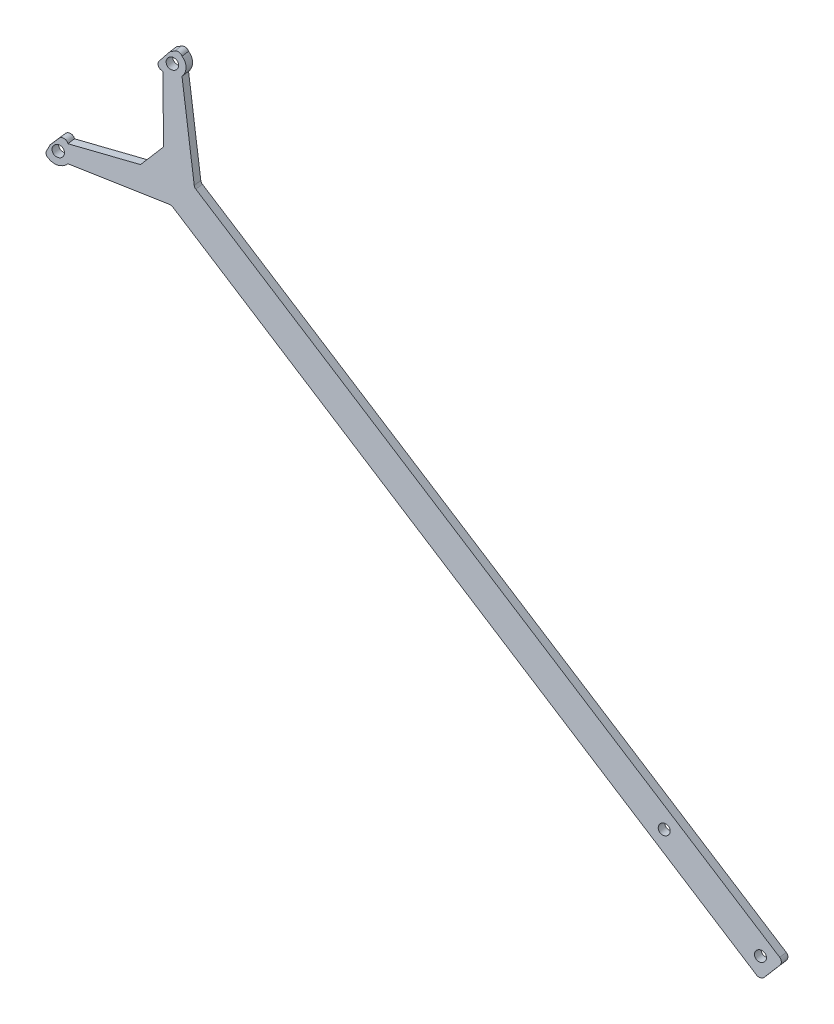
ISO-10303-21;
HEADER;
FILE_DESCRIPTION(('STEP AP214'),'2;1');
FILE_NAME('part.step','',(''),(''),'','','');
FILE_SCHEMA(('AUTOMOTIVE_DESIGN { 1 0 10303 214 1 1 1 1 }'));
ENDSEC;
DATA;
#1=APPLICATION_CONTEXT('core data for automotive mechanical design processes');
#2=APPLICATION_PROTOCOL_DEFINITION('international standard','automotive_design',2000,#1);
#3=PRODUCT_CONTEXT('',#1,'mechanical');
#4=PRODUCT('Part','Part','',(#3));
#5=PRODUCT_RELATED_PRODUCT_CATEGORY('part','',(#4));
#6=PRODUCT_DEFINITION_FORMATION('','',#4);
#7=PRODUCT_DEFINITION_CONTEXT('part definition',#1,'design');
#8=PRODUCT_DEFINITION('design','',#6,#7);
#9=PRODUCT_DEFINITION_SHAPE('','',#8);
#10=(LENGTH_UNIT() NAMED_UNIT(*) SI_UNIT(.MILLI.,.METRE.));
#11=(NAMED_UNIT(*) PLANE_ANGLE_UNIT() SI_UNIT($,.RADIAN.));
#12=(NAMED_UNIT(*) SI_UNIT($,.STERADIAN.) SOLID_ANGLE_UNIT());
#13=UNCERTAINTY_MEASURE_WITH_UNIT(LENGTH_MEASURE(1.E-05),#10,'distance_accuracy_value','');
#14=(GEOMETRIC_REPRESENTATION_CONTEXT(3) GLOBAL_UNCERTAINTY_ASSIGNED_CONTEXT((#13)) GLOBAL_UNIT_ASSIGNED_CONTEXT((#10,
#11,#12)) REPRESENTATION_CONTEXT('',''));
#15=CARTESIAN_POINT('',(0.,0.,0.));
#16=DIRECTION('',(0.,0.,1.));
#17=DIRECTION('',(1.,0.,0.));
#18=AXIS2_PLACEMENT_3D('',#15,#16,#17);
#19=CARTESIAN_POINT('',(38.6285026922329,20.4555824476356,159.237957676174));
#20=DIRECTION('',(-0.233930394424774,-0.123876985558802,-0.964329333274237));
#21=DIRECTION('',(-0.97181465537802,0.,0.235746210133905));
#22=AXIS2_PLACEMENT_3D('',#19,#20,#21);
#23=PLANE('',#22);
#24=DIRECTION('',(-0.96816081267746,-0.0612294878605861,0.242725339863909));
#25=VECTOR('',#24,1.);
#26=CARTESIAN_POINT('',(-151.084886063584,13.4326785363502,206.161454104588));
#27=LINE('',#26,#25);
#28=CARTESIAN_POINT('',(-138.182149915556,14.2486875257651,202.926639210517));
#29=VERTEX_POINT('',#28);
#30=CARTESIAN_POINT('',(-151.084886063584,13.4326785363502,206.161454104588));
#31=VERTEX_POINT('',#30);
#32=EDGE_CURVE('E263',#29,#31,#27,.T.);
#33=ORIENTED_EDGE('',*,*,#32,.T.);
#34=CARTESIAN_POINT('',(-152.007478281162,13.1480212719928,206.421826610653));
#35=DIRECTION('',(-0.233930394424774,-0.123876985558802,-0.964329333274237));
#36=DIRECTION('',(-0.97181465537802,0.,0.235746210133905));
#37=AXIS2_PLACEMENT_3D('',#34,#35,#36);
#38=CIRCLE('',#37,1.);
#39=CARTESIAN_POINT('',(-152.757094919694,13.8026350163769,206.519580080663));
#40=VERTEX_POINT('',#39);
#41=EDGE_CURVE('E337',#31,#40,#38,.F.);
#42=ORIENTED_EDGE('',*,*,#41,.T.);
#43=DIRECTION('',(-0.619153830481359,-0.745744821042901,0.245994300925757));
#44=VECTOR('',#43,1.);
#45=CARTESIAN_POINT('',(-154.143791942463,12.132416611556,207.070524850635));
#46=LINE('',#45,#44);
#47=CARTESIAN_POINT('',(-154.143791942463,12.132416611556,207.070524850635));
#48=VERTEX_POINT('',#47);
#49=EDGE_CURVE('E266',#40,#48,#46,.T.);
#50=ORIENTED_EDGE('',*,*,#49,.T.);
#51=DIRECTION('',(-0.361598481731838,-0.909614859686358,0.204566236331896));
#52=VECTOR('',#51,1.);
#53=CARTESIAN_POINT('',(-155.327539009485,9.1546554298249,207.740203221822));
#54=LINE('',#53,#52);
#55=CARTESIAN_POINT('',(-154.615897337573,10.9448173697854,207.337607896358));
#56=VERTEX_POINT('',#55);
#57=EDGE_CURVE('E268',#48,#56,#54,.T.);
#58=ORIENTED_EDGE('',*,*,#57,.T.);
#59=CARTESIAN_POINT('',(-153.713387997691,10.5482630866328,207.169615063356));
#60=DIRECTION('',(-0.233930394424774,-0.123876985558802,-0.964329333274237));
#61=DIRECTION('',(-0.97181465537802,0.,0.235746210133905));
#62=AXIS2_PLACEMENT_3D('',#59,#60,#61);
#63=CIRCLE('',#62,1.);
#64=CARTESIAN_POINT('',(-154.143773561432,9.67207967251809,207.386573334352));
#65=VERTEX_POINT('',#64);
#66=EDGE_CURVE('E335',#56,#65,#63,.F.);
#67=ORIENTED_EDGE('',*,*,#66,.T.);
#68=CARTESIAN_POINT('',(-152.614185290752,11.5522553092236,206.77399456351));
#69=DIRECTION('',(0.233930394424774,0.123876985558802,0.964329333274237));
#70=DIRECTION('',(0.97181465537802,0.,-0.235746210133905));
#71=AXIS2_PLACEMENT_3D('',#68,#69,#70);
#72=CIRCLE('',#71,2.49999069061246);
#73=CARTESIAN_POINT('',(-150.725075349122,9.93407152149013,206.523598256231));
#74=VERTEX_POINT('',#73);
#75=EDGE_CURVE('E271',#65,#74,#72,.T.);
#76=ORIENTED_EDGE('',*,*,#75,.T.);
#77=DIRECTION('',(0.972136703391047,-0.0451654619600152,-0.230022414051165));
#78=VECTOR('',#77,1.);
#79=CARTESIAN_POINT('',(-150.725075349122,9.93407152149013,206.523598256231));
#80=LINE('',#79,#78);
#81=CARTESIAN_POINT('',(-132.472729848036,9.0860677237375,202.204814118558));
#82=VERTEX_POINT('',#81);
#83=EDGE_CURVE('E199',#74,#82,#80,.T.);
#84=ORIENTED_EDGE('',*,*,#83,.T.);
#85=CARTESIAN_POINT('',(-132.487789744592,8.09479855065947,202.335805057255));
#86=DIRECTION('',(-0.233930394424774,-0.123876985558802,-0.964329333274237));
#87=DIRECTION('',(-0.97181465537802,0.,0.235746210133905));
#88=AXIS2_PLACEMENT_3D('',#85,#86,#87);
#89=CIRCLE('',#88,1.);
#90=CARTESIAN_POINT('',(-131.876008568814,8.8469199302998,202.090780113097));
#91=VERTEX_POINT('',#90);
#92=EDGE_CURVE('E379',#82,#91,#89,.T.);
#93=ORIENTED_EDGE('',*,*,#92,.T.);
#94=DIRECTION('',(0.755645660035762,-0.647277315176013,-0.100158443117139));
#95=VECTOR('',#94,1.);
#96=CARTESIAN_POINT('',(-16.5231212716797,-89.9630264987664,186.801119612432));
#97=LINE('',#96,#95);
#98=CARTESIAN_POINT('',(-17.2787669317155,-89.3157491835904,186.901278055549));
#99=VERTEX_POINT('',#98);
#100=EDGE_CURVE('E311',#91,#99,#97,.T.);
#101=ORIENTED_EDGE('',*,*,#100,.T.);
#102=CARTESIAN_POINT('',(-16.6669857559396,-88.5636278039528,186.656253111392));
#103=DIRECTION('',(-0.233930394424774,-0.123876985558802,-0.964329333274237));
#104=DIRECTION('',(-0.97181465537802,0.,0.235746210133905));
#105=AXIS2_PLACEMENT_3D('',#102,#103,#104);
#106=CIRCLE('',#105,1.);
#107=CARTESIAN_POINT('',(-15.9113400959038,-89.2109051191287,186.556094668275));
#108=VERTEX_POINT('',#107);
#109=EDGE_CURVE('E321',#99,#108,#106,.F.);
#110=ORIENTED_EDGE('',*,*,#109,.T.);
#111=DIRECTION('',(0.611781175775585,0.752121379637243,-0.245024944157147));
#112=VECTOR('',#111,1.);
#113=CARTESIAN_POINT('',(-12.8524342170262,-85.4502982209429,185.330969947489));
#114=LINE('',#113,#112);
#115=CARTESIAN_POINT('',(-13.4642153927972,-86.2024196005745,185.575994891645));
#116=VERTEX_POINT('',#115);
#117=EDGE_CURVE('E314',#108,#116,#114,.T.);
#118=ORIENTED_EDGE('',*,*,#117,.T.);
#119=CARTESIAN_POINT('',(-14.219861052833,-85.5551422853985,185.676153334762));
#120=DIRECTION('',(-0.233930394424774,-0.123876985558802,-0.964329333274237));
#121=DIRECTION('',(-0.97181465537802,0.,0.235746210133905));
#122=AXIS2_PLACEMENT_3D('',#119,#120,#121);
#123=CIRCLE('',#122,1.);
#124=CARTESIAN_POINT('',(-13.6080798770621,-84.8030209057668,185.431128390607));
#125=VERTEX_POINT('',#124);
#126=EDGE_CURVE('E329',#116,#125,#123,.F.);
#127=ORIENTED_EDGE('',*,*,#126,.T.);
#128=DIRECTION('',(-0.755645660035763,0.647277315176013,0.100158443117137));
#129=VECTOR('',#128,1.);
#130=CARTESIAN_POINT('',(-25.4341138726848,-74.6729772375418,186.998631806422));
#131=LINE('',#130,#129);
#132=CARTESIAN_POINT('',(-128.205321358954,13.3596480751758,200.620630427582));
#133=VERTEX_POINT('',#132);
#134=EDGE_CURVE('E318',#125,#133,#131,.T.);
#135=ORIENTED_EDGE('',*,*,#134,.T.);
#136=CARTESIAN_POINT('',(-127.5935401832,14.1117694547868,200.375605483434));
#137=DIRECTION('',(-0.233930394424774,-0.123876985558802,-0.964329333274237));
#138=DIRECTION('',(-0.97181465537802,0.,0.235746210133905));
#139=AXIS2_PLACEMENT_3D('',#136,#137,#138);
#140=CIRCLE('',#139,1.);
#141=CARTESIAN_POINT('',(-128.541257711986,13.9194042898564,200.630217205382));
#142=VERTEX_POINT('',#141);
#143=EDGE_CURVE('E42',#133,#142,#140,.T.);
#144=ORIENTED_EDGE('',*,*,#143,.T.);
#145=DIRECTION('',(-0.217043903845417,0.973473233206832,-0.0724003317214627));
#146=VECTOR('',#145,1.);
#147=CARTESIAN_POINT('',(-132.616360378258,32.1968278797439,199.270866495181));
#148=LINE('',#147,#146);
#149=CARTESIAN_POINT('',(-132.616360378258,32.1968278797439,199.270866495181));
#150=VERTEX_POINT('',#149);
#151=EDGE_CURVE('E246',#142,#150,#148,.T.);
#152=ORIENTED_EDGE('',*,*,#151,.T.);
#153=CARTESIAN_POINT('',(-134.505473842453,33.8150341871131,199.521260764121));
#154=DIRECTION('',(0.233930394424774,0.123876985558802,0.964329333274237));
#155=DIRECTION('',(0.97181465537802,0.,-0.235746210133905));
#156=AXIS2_PLACEMENT_3D('',#153,#154,#155);
#157=CIRCLE('',#156,2.50000772473441);
#158=CARTESIAN_POINT('',(-132.976164194131,35.6954702259671,198.908716131414));
#159=VERTEX_POINT('',#158);
#160=EDGE_CURVE('E207',#150,#159,#157,.T.);
#161=ORIENTED_EDGE('',*,*,#160,.T.);
#162=CARTESIAN_POINT('',(-133.849033145653,35.2853732185679,199.173140483527));
#163=DIRECTION('',(-0.233930394424774,-0.123876985558802,-0.964329333274237));
#164=DIRECTION('',(-0.97181465537802,0.,0.235746210133905));
#165=AXIS2_PLACEMENT_3D('',#162,#163,#164);
#166=CIRCLE('',#165,1.);
#167=CARTESIAN_POINT('',(-134.298141201005,36.1788316694718,199.167313724039));
#168=VERTEX_POINT('',#167);
#169=EDGE_CURVE('E331',#159,#168,#166,.F.);
#170=ORIENTED_EDGE('',*,*,#169,.T.);
#171=DIRECTION('',(-0.862309993669386,-0.431725015440583,0.2646412399093));
#172=VECTOR('',#171,1.);
#173=CARTESIAN_POINT('',(-132.691635505788,36.9831464764028,198.674280288007));
#174=LINE('',#173,#172);
#175=CARTESIAN_POINT('',(-135.131606805187,35.761547915977,199.423102677584));
#176=VERTEX_POINT('',#175);
#177=EDGE_CURVE('E250',#168,#176,#174,.T.);
#178=ORIENTED_EDGE('',*,*,#177,.T.);
#179=DIRECTION('',(-0.57863317483441,-0.779328925295112,0.240478845596484));
#180=VECTOR('',#179,1.);
#181=CARTESIAN_POINT('',(-135.131606805187,35.761547915977,199.423102677584));
#182=LINE('',#181,#180);
#183=CARTESIAN_POINT('',(-136.781486102832,33.5394170119401,200.108789371896));
#184=VERTEX_POINT('',#183);
#185=EDGE_CURVE('E252',#176,#184,#182,.T.);
#186=ORIENTED_EDGE('',*,*,#185,.T.);
#187=CARTESIAN_POINT('',(-136.000166565418,32.9251687570405,199.998159982458));
#188=DIRECTION('',(-0.233930394424774,-0.123876985558802,-0.964329333274237));
#189=DIRECTION('',(-0.97181465537802,0.,0.235746210133905));
#190=AXIS2_PLACEMENT_3D('',#187,#188,#189);
#191=CIRCLE('',#190,1.);
#192=CARTESIAN_POINT('',(-136.052769983215,31.9363843222992,200.137939172788));
#193=VERTEX_POINT('',#192);
#194=EDGE_CURVE('E333',#184,#193,#191,.F.);
#195=ORIENTED_EDGE('',*,*,#194,.T.);
#196=DIRECTION('',(0.97082925944799,-0.0834256199384901,-0.224790379993328));
#197=VECTOR('',#196,1.);
#198=CARTESIAN_POINT('',(-136.035070073009,31.9348633277809,200.1338408522));
#199=LINE('',#198,#197);
#200=CARTESIAN_POINT('',(-136.035070073009,31.9348633277809,200.1338408522));
#201=VERTEX_POINT('',#200);
#202=EDGE_CURVE('E255',#193,#201,#199,.T.);
#203=ORIENTED_EDGE('',*,*,#202,.T.);
#204=DIRECTION('',(0.114324340182568,-0.988473724833063,0.0992453553395369));
#205=VECTOR('',#204,1.);
#206=CARTESIAN_POINT('',(-134.511462860903,18.7614158035886,201.456489545574));
#207=LINE('',#206,#205);
#208=CARTESIAN_POINT('',(-134.511462860903,18.7614158035886,201.456489545574));
#209=VERTEX_POINT('',#208);
#210=EDGE_CURVE('E257',#201,#209,#207,.T.);
#211=ORIENTED_EDGE('',*,*,#210,.T.);
#212=DIRECTION('',(-0.61178117577558,-0.752121379637245,0.245024944157153));
#213=VECTOR('',#212,1.);
#214=CARTESIAN_POINT('',(-138.182149915556,14.2486875257651,202.926639210517));
#215=LINE('',#214,#213);
#216=EDGE_CURVE('E260',#209,#29,#215,.T.);
#217=ORIENTED_EDGE('',*,*,#216,.T.);
#218=EDGE_LOOP('',(#33,#42,#50,#58,#67,#76,#84,#93,#101,#110,#118,#127,#135,#144,#152,#161,#170,
#178,#186,#195,#203,#211,#217));
#219=FACE_BOUND('',#218,.T.);
#220=CARTESIAN_POINT('',(-16.954585245294,-85.7646712331469,186.366468251513));
#221=DIRECTION('',(0.233930394424774,0.123876985558802,0.964329333274237));
#222=DIRECTION('',(0.971814655378021,0.,-0.235746210133904));
#223=AXIS2_PLACEMENT_3D('',#220,#221,#222);
#224=CIRCLE('',#223,1.10000033999937);
#225=CARTESIAN_POINT('',(-15.8855887939618,-85.7646712331469,186.107147340212));
#226=VERTEX_POINT('',#225);
#227=EDGE_CURVE('E305',#226,#226,#224,.T.);
#228=ORIENTED_EDGE('',*,*,#227,.F.);
#229=EDGE_LOOP('',(#228));
#230=FACE_BOUND('',#229,.T.);
#231=CARTESIAN_POINT('',(-35.8458041243041,-69.5826720725501,188.870439585666));
#232=DIRECTION('',(0.233930394424774,0.123876985558802,0.964329333274237));
#233=DIRECTION('',(0.971814655378021,0.,-0.235746210133904));
#234=AXIS2_PLACEMENT_3D('',#231,#232,#233);
#235=CIRCLE('',#234,1.1000003399993);
#236=CARTESIAN_POINT('',(-34.776807672972,-69.5826720725501,188.611118674365));
#237=VERTEX_POINT('',#236);
#238=EDGE_CURVE('E299',#237,#237,#235,.T.);
#239=ORIENTED_EDGE('',*,*,#238,.F.);
#240=EDGE_LOOP('',(#239));
#241=FACE_BOUND('',#240,.T.);
#242=CARTESIAN_POINT('',(-152.614185290752,11.5522553092236,206.77399456351));
#243=DIRECTION('',(0.233930394424774,0.123876985558802,0.964329333274237));
#244=DIRECTION('',(0.97181465537802,0.,-0.235746210133905));
#245=AXIS2_PLACEMENT_3D('',#242,#243,#244);
#246=CIRCLE('',#245,1.15000024000004);
#247=CARTESIAN_POINT('',(-151.496598203832,11.5522553092236,206.502886365277));
#248=VERTEX_POINT('',#247);
#249=EDGE_CURVE('E735',#248,#248,#246,.T.);
#250=ORIENTED_EDGE('',*,*,#249,.F.);
#251=EDGE_LOOP('',(#250));
#252=FACE_BOUND('',#251,.T.);
#253=CARTESIAN_POINT('',(-134.505473842453,33.8150341871131,199.521260764121));
#254=DIRECTION('',(0.233930394424774,0.123876985558802,0.964329333274237));
#255=DIRECTION('',(0.97181465537802,0.,-0.235746210133905));
#256=AXIS2_PLACEMENT_3D('',#253,#254,#255);
#257=CIRCLE('',#256,1.15000023999998);
#258=CARTESIAN_POINT('',(-133.387886755533,33.8150341871131,199.250152565888));
#259=VERTEX_POINT('',#258);
#260=EDGE_CURVE('E738',#259,#259,#257,.T.);
#261=ORIENTED_EDGE('',*,*,#260,.F.);
#262=EDGE_LOOP('',(#261));
#263=FACE_BOUND('',#262,.T.);
#264=ADVANCED_FACE('F34',(#219,#230,#241,#252,#263),#23,.F.);
#265=CARTESIAN_POINT('',(38.1606419033834,20.207828476518,157.309299009626));
#266=DIRECTION('',(-0.233930394424774,-0.123876985558802,-0.964329333274237));
#267=DIRECTION('',(-0.97181465537802,0.,0.235746210133905));
#268=AXIS2_PLACEMENT_3D('',#265,#266,#267);
#269=PLANE('',#268);
#270=CARTESIAN_POINT('',(-17.4224460341436,-86.0124252042645,184.437809584964));
#271=DIRECTION('',(0.233930394424774,0.123876985558802,0.964329333274237));
#272=DIRECTION('',(0.971814655378021,0.,-0.235746210133904));
#273=AXIS2_PLACEMENT_3D('',#270,#271,#272);
#274=CIRCLE('',#273,1.10000033999937);
#275=CARTESIAN_POINT('',(-16.3534495828114,-86.0124252042645,184.178488673664));
#276=VERTEX_POINT('',#275);
#277=EDGE_CURVE('E302',#276,#276,#274,.T.);
#278=ORIENTED_EDGE('',*,*,#277,.T.);
#279=EDGE_LOOP('',(#278));
#280=FACE_BOUND('',#279,.T.);
#281=DIRECTION('',(-0.619153830481359,-0.745744821042901,0.245994300925757));
#282=VECTOR('',#281,1.);
#283=CARTESIAN_POINT('',(-154.611652731312,11.8846626404384,205.141866184086));
#284=LINE('',#283,#282);
#285=CARTESIAN_POINT('',(-153.224955708543,13.5548810452593,204.590921414115));
#286=VERTEX_POINT('',#285);
#287=CARTESIAN_POINT('',(-154.611652731312,11.8846626404384,205.141866184086));
#288=VERTEX_POINT('',#287);
#289=EDGE_CURVE('E236',#286,#288,#284,.T.);
#290=ORIENTED_EDGE('',*,*,#289,.F.);
#291=CARTESIAN_POINT('',(-152.475339070011,12.9002673008752,204.493167944105));
#292=DIRECTION('',(-0.233930394424774,-0.123876985558802,-0.964329333274237));
#293=DIRECTION('',(-0.97181465537802,0.,0.235746210133905));
#294=AXIS2_PLACEMENT_3D('',#291,#292,#293);
#295=CIRCLE('',#294,1.);
#296=CARTESIAN_POINT('',(-151.552746852434,13.1849245652326,204.232795438039));
#297=VERTEX_POINT('',#296);
#298=EDGE_CURVE('E349',#286,#297,#295,.T.);
#299=ORIENTED_EDGE('',*,*,#298,.T.);
#300=DIRECTION('',(-0.96816081267746,-0.0612294878605861,0.242725339863909));
#301=VECTOR('',#300,1.);
#302=CARTESIAN_POINT('',(-151.552746852434,13.1849245652326,204.232795438039));
#303=LINE('',#302,#301);
#304=CARTESIAN_POINT('',(-138.650010704406,14.0009335546475,200.997980543969));
#305=VERTEX_POINT('',#304);
#306=EDGE_CURVE('E233',#305,#297,#303,.T.);
#307=ORIENTED_EDGE('',*,*,#306,.F.);
#308=DIRECTION('',(-0.61178117577558,-0.752121379637245,0.245024944157153));
#309=VECTOR('',#308,1.);
#310=CARTESIAN_POINT('',(-138.650010704406,14.0009335546475,200.997980543969));
#311=LINE('',#310,#309);
#312=CARTESIAN_POINT('',(-134.979323649752,18.513661832471,199.527830879026));
#313=VERTEX_POINT('',#312);
#314=EDGE_CURVE('E230',#313,#305,#311,.T.);
#315=ORIENTED_EDGE('',*,*,#314,.F.);
#316=DIRECTION('',(0.114324340182568,-0.988473724833063,0.0992453553395369));
#317=VECTOR('',#316,1.);
#318=CARTESIAN_POINT('',(-134.979323649752,18.513661832471,199.527830879026));
#319=LINE('',#318,#317);
#320=CARTESIAN_POINT('',(-136.502930861858,31.6871093566633,198.205182185652));
#321=VERTEX_POINT('',#320);
#322=EDGE_CURVE('E227',#321,#313,#319,.T.);
#323=ORIENTED_EDGE('',*,*,#322,.F.);
#324=DIRECTION('',(0.97082925944799,-0.0834256199384901,-0.224790379993328));
#325=VECTOR('',#324,1.);
#326=CARTESIAN_POINT('',(-136.502930861858,31.6871093566633,198.205182185652));
#327=LINE('',#326,#325);
#328=CARTESIAN_POINT('',(-136.520630772064,31.6886303511816,198.209280506239));
#329=VERTEX_POINT('',#328);
#330=EDGE_CURVE('E225',#329,#321,#327,.T.);
#331=ORIENTED_EDGE('',*,*,#330,.F.);
#332=CARTESIAN_POINT('',(-136.468027354267,32.6774147859229,198.069501315909));
#333=DIRECTION('',(-0.233930394424774,-0.123876985558802,-0.964329333274237));
#334=DIRECTION('',(-0.97181465537802,0.,0.235746210133905));
#335=AXIS2_PLACEMENT_3D('',#332,#333,#334);
#336=CIRCLE('',#335,1.);
#337=CARTESIAN_POINT('',(-137.249346891682,33.2916630408225,198.180130705347));
#338=VERTEX_POINT('',#337);
#339=EDGE_CURVE('E345',#329,#338,#336,.T.);
#340=ORIENTED_EDGE('',*,*,#339,.T.);
#341=DIRECTION('',(-0.57863317483441,-0.779328925295112,0.240478845596484));
#342=VECTOR('',#341,1.);
#343=CARTESIAN_POINT('',(-135.599467594036,35.5137939448594,197.494444011036));
#344=LINE('',#343,#342);
#345=CARTESIAN_POINT('',(-135.599467594036,35.5137939448594,197.494444011036));
#346=VERTEX_POINT('',#345);
#347=EDGE_CURVE('E219',#346,#338,#344,.T.);
#348=ORIENTED_EDGE('',*,*,#347,.F.);
#349=DIRECTION('',(-0.862309993669386,-0.431725015440583,0.2646412399093));
#350=VECTOR('',#349,1.);
#351=CARTESIAN_POINT('',(-133.159496294638,36.7353925052852,196.745621621459));
#352=LINE('',#351,#350);
#353=CARTESIAN_POINT('',(-134.766001989855,35.9310776983542,197.238655057491));
#354=VERTEX_POINT('',#353);
#355=EDGE_CURVE('E217',#354,#346,#352,.T.);
#356=ORIENTED_EDGE('',*,*,#355,.F.);
#357=CARTESIAN_POINT('',(-134.316893934503,35.0376192474503,197.244481816978));
#358=DIRECTION('',(-0.233930394424774,-0.123876985558802,-0.964329333274237));
#359=DIRECTION('',(-0.97181465537802,0.,0.235746210133905));
#360=AXIS2_PLACEMENT_3D('',#357,#358,#359);
#361=CIRCLE('',#360,1.);
#362=CARTESIAN_POINT('',(-133.44402498298,35.4477162548495,196.980057464866));
#363=VERTEX_POINT('',#362);
#364=EDGE_CURVE('E216',#354,#363,#361,.T.);
#365=ORIENTED_EDGE('',*,*,#364,.T.);
#366=CARTESIAN_POINT('',(-134.973334631303,33.5672802159955,197.592602097573));
#367=DIRECTION('',(0.233930394424774,0.123876985558802,0.964329333274237));
#368=DIRECTION('',(0.97181465537802,0.,-0.235746210133905));
#369=AXIS2_PLACEMENT_3D('',#366,#367,#368);
#370=CIRCLE('',#369,2.50000772473441);
#371=CARTESIAN_POINT('',(-133.084221167108,31.9490739086263,197.342207828632));
#372=VERTEX_POINT('',#371);
#373=EDGE_CURVE('E198',#372,#363,#370,.T.);
#374=ORIENTED_EDGE('',*,*,#373,.F.);
#375=DIRECTION('',(-0.217043903845417,0.973473233206832,-0.0724003317214627));
#376=VECTOR('',#375,1.);
#377=CARTESIAN_POINT('',(-133.084221167108,31.9490739086263,197.342207828632));
#378=LINE('',#377,#376);
#379=CARTESIAN_POINT('',(-129.009118500836,13.6716503187388,198.701558538834));
#380=VERTEX_POINT('',#379);
#381=EDGE_CURVE('E189',#380,#372,#378,.T.);
#382=ORIENTED_EDGE('',*,*,#381,.F.);
#383=CARTESIAN_POINT('',(-128.06140097205,13.8640154836692,198.446946816885));
#384=DIRECTION('',(-0.233930394424774,-0.123876985558802,-0.964329333274237));
#385=DIRECTION('',(-0.97181465537802,0.,0.235746210133905));
#386=AXIS2_PLACEMENT_3D('',#383,#384,#385);
#387=CIRCLE('',#386,1.);
#388=CARTESIAN_POINT('',(-128.673182147825,13.111894104032,198.691971761044));
#389=VERTEX_POINT('',#388);
#390=EDGE_CURVE('E11',#380,#389,#387,.F.);
#391=ORIENTED_EDGE('',*,*,#390,.T.);
#392=DIRECTION('',(-0.755645660035931,0.647277315175804,0.100158443117217));
#393=VECTOR('',#392,1.);
#394=CARTESIAN_POINT('',(-36.7453878451006,-65.6323891404078,186.507233273797));
#395=LINE('',#394,#393);
#396=CARTESIAN_POINT('',(-14.0759406659072,-85.0507748768788,183.502469724056));
#397=VERTEX_POINT('',#396);
#398=EDGE_CURVE('E324',#397,#389,#395,.T.);
#399=ORIENTED_EDGE('',*,*,#398,.F.);
#400=CARTESIAN_POINT('',(-14.6877218416825,-85.8028962565162,183.747494668213));
#401=DIRECTION('',(-0.233930394424774,-0.123876985558802,-0.964329333274237));
#402=DIRECTION('',(-0.97181465537802,0.,0.235746210133905));
#403=AXIS2_PLACEMENT_3D('',#400,#401,#402);
#404=CIRCLE('',#403,1.);
#405=CARTESIAN_POINT('',(-13.9320761816467,-86.4501735716921,183.647336225096));
#406=VERTEX_POINT('',#405);
#407=EDGE_CURVE('E55',#397,#406,#404,.T.);
#408=ORIENTED_EDGE('',*,*,#407,.T.);
#409=DIRECTION('',(0.611781175775585,0.752121379637243,-0.245024944157147));
#410=VECTOR('',#409,1.);
#411=CARTESIAN_POINT('',(-13.3202950058757,-85.6980521920605,183.402311280941));
#412=LINE('',#411,#410);
#413=CARTESIAN_POINT('',(-16.3792008847533,-89.4586590902463,184.627436001727));
#414=VERTEX_POINT('',#413);
#415=EDGE_CURVE('E308',#414,#406,#412,.T.);
#416=ORIENTED_EDGE('',*,*,#415,.F.);
#417=CARTESIAN_POINT('',(-17.1348465447891,-88.8113817750704,184.727594444844));
#418=DIRECTION('',(-0.233930394424774,-0.123876985558802,-0.964329333274237));
#419=DIRECTION('',(-0.97181465537802,0.,0.235746210133905));
#420=AXIS2_PLACEMENT_3D('',#417,#418,#419);
#421=CIRCLE('',#420,1.);
#422=CARTESIAN_POINT('',(-17.7466277205647,-89.5635031547076,184.972619389001));
#423=VERTEX_POINT('',#422);
#424=EDGE_CURVE('E341',#414,#423,#421,.T.);
#425=ORIENTED_EDGE('',*,*,#424,.T.);
#426=DIRECTION('',(0.755645660035781,-0.64727731517599,-0.100158443117145));
#427=VECTOR('',#426,1.);
#428=CARTESIAN_POINT('',(-29.5726617161879,-79.4334594864829,186.540122804816));
#429=LINE('',#428,#427);
#430=CARTESIAN_POINT('',(-132.343869357666,8.59916595917909,200.16212144655));
#431=VERTEX_POINT('',#430);
#432=EDGE_CURVE('E315',#431,#423,#429,.T.);
#433=ORIENTED_EDGE('',*,*,#432,.F.);
#434=CARTESIAN_POINT('',(-132.955650533441,7.84704457954187,200.407146390707));
#435=DIRECTION('',(-0.233930394424774,-0.123876985558802,-0.964329333274237));
#436=DIRECTION('',(-0.97181465537802,0.,0.235746210133905));
#437=AXIS2_PLACEMENT_3D('',#434,#435,#436);
#438=CIRCLE('',#437,1.);
#439=CARTESIAN_POINT('',(-132.940590636886,8.8383137526199,200.276155452009));
#440=VERTEX_POINT('',#439);
#441=EDGE_CURVE('E381',#431,#440,#438,.F.);
#442=ORIENTED_EDGE('',*,*,#441,.T.);
#443=DIRECTION('',(0.972136703391047,-0.0451654619600152,-0.230022414051165));
#444=VECTOR('',#443,1.);
#445=CARTESIAN_POINT('',(-151.192936137971,9.68631755037252,204.594939589683));
#446=LINE('',#445,#444);
#447=CARTESIAN_POINT('',(-151.192936137971,9.68631755037252,204.594939589683));
#448=VERTEX_POINT('',#447);
#449=EDGE_CURVE('E209',#448,#440,#446,.T.);
#450=ORIENTED_EDGE('',*,*,#449,.F.);
#451=CARTESIAN_POINT('',(-153.082046079602,11.304501338106,204.845335896962));
#452=DIRECTION('',(0.233930394424774,0.123876985558802,0.964329333274237));
#453=DIRECTION('',(0.97181465537802,0.,-0.235746210133905));
#454=AXIS2_PLACEMENT_3D('',#451,#452,#453);
#455=CIRCLE('',#454,2.49999069061246);
#456=CARTESIAN_POINT('',(-154.611634350282,9.42432570140048,205.457914667804));
#457=VERTEX_POINT('',#456);
#458=EDGE_CURVE('E241',#457,#448,#455,.T.);
#459=ORIENTED_EDGE('',*,*,#458,.F.);
#460=CARTESIAN_POINT('',(-154.18124878654,10.3005091155152,205.240956396808));
#461=DIRECTION('',(-0.233930394424774,-0.123876985558802,-0.964329333274237));
#462=DIRECTION('',(-0.97181465537802,0.,0.235746210133905));
#463=AXIS2_PLACEMENT_3D('',#460,#461,#462);
#464=CIRCLE('',#463,1.);
#465=CARTESIAN_POINT('',(-155.083758126422,10.6970633986678,205.408949229809));
#466=VERTEX_POINT('',#465);
#467=EDGE_CURVE('E347',#457,#466,#464,.T.);
#468=ORIENTED_EDGE('',*,*,#467,.T.);
#469=DIRECTION('',(-0.361598481731838,-0.909614859686358,0.204566236331896));
#470=VECTOR('',#469,1.);
#471=CARTESIAN_POINT('',(-155.795399798335,8.9069014587073,205.811544555273));
#472=LINE('',#471,#470);
#473=EDGE_CURVE('E238',#288,#466,#472,.T.);
#474=ORIENTED_EDGE('',*,*,#473,.F.);
#475=EDGE_LOOP('',(#290,#299,#307,#315,#323,#331,#340,#348,#356,#365,#374,#382,#391,#399,#408,
#416,#425,#433,#442,#450,#459,#468,#474));
#476=FACE_BOUND('',#475,.T.);
#477=CARTESIAN_POINT('',(-36.3136649131537,-69.8304260436677,186.941780919118));
#478=DIRECTION('',(0.233930394424774,0.123876985558802,0.964329333274237));
#479=DIRECTION('',(0.971814655378021,0.,-0.235746210133904));
#480=AXIS2_PLACEMENT_3D('',#477,#478,#479);
#481=CIRCLE('',#480,1.1000003399993);
#482=CARTESIAN_POINT('',(-35.2446684618216,-69.8304260436677,186.682460007817));
#483=VERTEX_POINT('',#482);
#484=EDGE_CURVE('E278',#483,#483,#481,.T.);
#485=ORIENTED_EDGE('',*,*,#484,.T.);
#486=EDGE_LOOP('',(#485));
#487=FACE_BOUND('',#486,.T.);
#488=CARTESIAN_POINT('',(-153.082046079602,11.304501338106,204.845335896962));
#489=DIRECTION('',(0.233930394424774,0.123876985558802,0.964329333274237));
#490=DIRECTION('',(0.97181465537802,0.,-0.235746210133905));
#491=AXIS2_PLACEMENT_3D('',#488,#489,#490);
#492=CIRCLE('',#491,1.15000024000004);
#493=CARTESIAN_POINT('',(-151.964458992681,11.304501338106,204.574227698729));
#494=VERTEX_POINT('',#493);
#495=EDGE_CURVE('E740',#494,#494,#492,.T.);
#496=ORIENTED_EDGE('',*,*,#495,.T.);
#497=EDGE_LOOP('',(#496));
#498=FACE_BOUND('',#497,.T.);
#499=CARTESIAN_POINT('',(-134.973334631303,33.5672802159955,197.592602097573));
#500=DIRECTION('',(0.233930394424774,0.123876985558802,0.964329333274237));
#501=DIRECTION('',(0.97181465537802,0.,-0.235746210133905));
#502=AXIS2_PLACEMENT_3D('',#499,#500,#501);
#503=CIRCLE('',#502,1.15000023999998);
#504=CARTESIAN_POINT('',(-133.855747544383,33.5672802159955,197.32149389934));
#505=VERTEX_POINT('',#504);
#506=EDGE_CURVE('E248',#505,#505,#503,.T.);
#507=ORIENTED_EDGE('',*,*,#506,.T.);
#508=EDGE_LOOP('',(#507));
#509=FACE_BOUND('',#508,.T.);
#510=ADVANCED_FACE('F212',(#280,#476,#487,#498,#509),#269,.T.);
#511=CARTESIAN_POINT('',(-12.8524342170262,-85.4502982209429,185.330969947489));
#512=DIRECTION('',(-0.755645660035782,0.647277315175989,0.100158443117146));
#513=DIRECTION('',(-0.650548598653905,-0.759464627740779,0.));
#514=AXIS2_PLACEMENT_3D('',#511,#512,#513);
#515=PLANE('',#514);
#516=ORIENTED_EDGE('',*,*,#415,.T.);
#517=DIRECTION('',(-0.233930394424774,-0.123876985558802,-0.964329333274237));
#518=VECTOR('',#517,1.);
#519=CARTESIAN_POINT('',(-13.4642153927972,-86.2024196005745,185.575994891645));
#520=LINE('',#519,#518);
#521=EDGE_CURVE('E377',#406,#116,#520,.F.);
#522=ORIENTED_EDGE('',*,*,#521,.T.);
#523=ORIENTED_EDGE('',*,*,#117,.F.);
#524=DIRECTION('',(-0.233930394424774,-0.123876985558802,-0.964329333274237));
#525=VECTOR('',#524,1.);
#526=CARTESIAN_POINT('',(-15.9113400959038,-89.2109051191287,186.556094668275));
#527=LINE('',#526,#525);
#528=EDGE_CURVE('E374',#108,#414,#527,.T.);
#529=ORIENTED_EDGE('',*,*,#528,.T.);
#530=EDGE_LOOP('',(#516,#522,#523,#529));
#531=FACE_BOUND('',#530,.T.);
#532=ADVANCED_FACE('F392',(#531),#515,.F.);
#533=CARTESIAN_POINT('',(-36.277527056251,-65.3846351692901,188.435891940345));
#534=DIRECTION('',(-0.611781175775398,-0.752121379637402,0.245024944157127));
#535=DIRECTION('',(0.77576933080262,-0.631016596759589,0.));
#536=AXIS2_PLACEMENT_3D('',#533,#534,#535);
#537=PLANE('',#536);
#538=ORIENTED_EDGE('',*,*,#398,.T.);
#539=DIRECTION('',(0.233930394424775,0.123876985558801,0.964329333274237));
#540=VECTOR('',#539,1.);
#541=CARTESIAN_POINT('',(-128.205321358976,13.3596480751495,200.620630427591));
#542=LINE('',#541,#540);
#543=EDGE_CURVE('E370',#389,#133,#542,.T.);
#544=ORIENTED_EDGE('',*,*,#543,.T.);
#545=ORIENTED_EDGE('',*,*,#134,.F.);
#546=DIRECTION('',(-0.233930394424774,-0.123876985558802,-0.964329333274237));
#547=VECTOR('',#546,1.);
#548=CARTESIAN_POINT('',(-13.6080798770576,-84.8030209057612,185.431128390605));
#549=LINE('',#548,#547);
#550=EDGE_CURVE('E368',#125,#397,#549,.T.);
#551=ORIENTED_EDGE('',*,*,#550,.T.);
#552=EDGE_LOOP('',(#538,#544,#545,#551));
#553=FACE_BOUND('',#552,.T.);
#554=ADVANCED_FACE('F389',(#553),#537,.F.);
#555=CARTESIAN_POINT('',(-29.1048009273383,-79.1857055153653,188.468781471365));
#556=DIRECTION('',(0.611781175775586,0.752121379637241,-0.245024944157152));
#557=DIRECTION('',(-0.775769330802459,0.631016596759788,0.));
#558=AXIS2_PLACEMENT_3D('',#555,#556,#557);
#559=PLANE('',#558);
#560=ORIENTED_EDGE('',*,*,#100,.F.);
#561=DIRECTION('',(0.233930394424774,0.123876985558802,0.964329333274237));
#562=VECTOR('',#561,1.);
#563=CARTESIAN_POINT('',(-131.876008568816,8.8469199302967,202.090780113098));
#564=LINE('',#563,#562);
#565=EDGE_CURVE('E366',#91,#431,#564,.F.);
#566=ORIENTED_EDGE('',*,*,#565,.T.);
#567=ORIENTED_EDGE('',*,*,#432,.T.);
#568=DIRECTION('',(-0.233930394424774,-0.123876985558802,-0.964329333274237));
#569=VECTOR('',#568,1.);
#570=CARTESIAN_POINT('',(-17.2787669317152,-89.31574918359,186.901278055549));
#571=LINE('',#570,#569);
#572=EDGE_CURVE('E364',#423,#99,#571,.F.);
#573=ORIENTED_EDGE('',*,*,#572,.T.);
#574=EDGE_LOOP('',(#560,#566,#567,#573));
#575=FACE_BOUND('',#574,.T.);
#576=ADVANCED_FACE('F404',(#575),#559,.F.);
#577=CARTESIAN_POINT('',(-16.954585245294,-85.7646712331469,186.366468251513));
#578=DIRECTION('',(-0.233930394424774,-0.123876985558802,-0.964329333274237));
#579=DIRECTION('',(-0.971814655378021,0.,0.235746210133904));
#580=AXIS2_PLACEMENT_3D('',#577,#578,#579);
#581=CYLINDRICAL_SURFACE('',#580,1.10000033999937);
#582=ORIENTED_EDGE('',*,*,#227,.T.);
#583=EDGE_LOOP('',(#582));
#584=FACE_BOUND('',#583,.T.);
#585=ORIENTED_EDGE('',*,*,#277,.F.);
#586=EDGE_LOOP('',(#585));
#587=FACE_BOUND('',#586,.T.);
#588=ADVANCED_FACE('F483',(#584,#587),#581,.F.);
#589=CARTESIAN_POINT('',(-35.8458041243041,-69.5826720725501,188.870439585666));
#590=DIRECTION('',(-0.233930394424774,-0.123876985558802,-0.964329333274237));
#591=DIRECTION('',(-0.971814655378021,0.,0.235746210133904));
#592=AXIS2_PLACEMENT_3D('',#589,#590,#591);
#593=CYLINDRICAL_SURFACE('',#592,1.1000003399993);
#594=ORIENTED_EDGE('',*,*,#238,.T.);
#595=EDGE_LOOP('',(#594));
#596=FACE_BOUND('',#595,.T.);
#597=ORIENTED_EDGE('',*,*,#484,.F.);
#598=EDGE_LOOP('',(#597));
#599=FACE_BOUND('',#598,.T.);
#600=ADVANCED_FACE('F647',(#596,#599),#593,.F.);
#601=CARTESIAN_POINT('',(-151.192936137971,9.68631755037252,204.594939589683));
#602=DIRECTION('',(-0.0150598965553075,-0.991269173078031,0.130990938697838));
#603=DIRECTION('',(0.,-0.13100579562922,-0.991381602366896));
#604=AXIS2_PLACEMENT_3D('',#601,#602,#603);
#605=PLANE('',#604);
#606=ORIENTED_EDGE('',*,*,#449,.T.);
#607=DIRECTION('',(0.233930394424774,0.123876985558802,0.964329333274237));
#608=VECTOR('',#607,1.);
#609=CARTESIAN_POINT('',(-132.940590636886,8.8383137526199,200.276155452009));
#610=LINE('',#609,#608);
#611=EDGE_CURVE('E361',#440,#82,#610,.T.);
#612=ORIENTED_EDGE('',*,*,#611,.T.);
#613=ORIENTED_EDGE('',*,*,#83,.F.);
#614=DIRECTION('',(0.233930394424774,0.123876985558802,0.964329333274237));
#615=VECTOR('',#614,1.);
#616=CARTESIAN_POINT('',(-151.192936137971,9.68631755037252,204.594939589683));
#617=LINE('',#616,#615);
#618=EDGE_CURVE('E276',#448,#74,#617,.T.);
#619=ORIENTED_EDGE('',*,*,#618,.F.);
#620=EDGE_LOOP('',(#606,#612,#613,#619));
#621=FACE_BOUND('',#620,.T.);
#622=ADVANCED_FACE('F412',(#621),#605,.T.);
#623=CARTESIAN_POINT('',(-153.082046079602,11.304501338106,204.845335896962));
#624=DIRECTION('',(0.233930394424774,0.123876985558802,0.964329333274237));
#625=DIRECTION('',(0.97181465537802,0.,-0.235746210133905));
#626=AXIS2_PLACEMENT_3D('',#623,#624,#625);
#627=CYLINDRICAL_SURFACE('',#626,2.49999069061246);
#628=ORIENTED_EDGE('',*,*,#75,.F.);
#629=DIRECTION('',(0.233930394424774,0.123876985558802,0.964329333274237));
#630=VECTOR('',#629,1.);
#631=CARTESIAN_POINT('',(-154.611634350282,9.42432570140048,205.457914667804));
#632=LINE('',#631,#630);
#633=EDGE_CURVE('E279',#457,#65,#632,.T.);
#634=ORIENTED_EDGE('',*,*,#633,.F.);
#635=ORIENTED_EDGE('',*,*,#458,.T.);
#636=ORIENTED_EDGE('',*,*,#618,.T.);
#637=EDGE_LOOP('',(#628,#634,#635,#636));
#638=FACE_BOUND('',#637,.T.);
#639=ADVANCED_FACE('F416',(#638),#627,.T.);
#640=CARTESIAN_POINT('',(-155.795399798335,8.9069014587073,205.811544555273));
#641=DIRECTION('',(-0.902509339881589,0.396554283152551,0.167992833001486));
#642=DIRECTION('',(-0.402271275371332,-0.915520519164438,0.));
#643=AXIS2_PLACEMENT_3D('',#640,#641,#642);
#644=PLANE('',#643);
#645=ORIENTED_EDGE('',*,*,#473,.T.);
#646=DIRECTION('',(-0.233930394424774,-0.123876985558802,-0.964329333274237));
#647=VECTOR('',#646,1.);
#648=CARTESIAN_POINT('',(-154.615897337573,10.9448173697854,207.337607896358));
#649=LINE('',#648,#647);
#650=EDGE_CURVE('E351',#466,#56,#649,.F.);
#651=ORIENTED_EDGE('',*,*,#650,.T.);
#652=ORIENTED_EDGE('',*,*,#57,.F.);
#653=DIRECTION('',(0.233930394424774,0.123876985558802,0.964329333274237));
#654=VECTOR('',#653,1.);
#655=CARTESIAN_POINT('',(-154.611652731312,11.8846626404384,205.141866184086));
#656=LINE('',#655,#654);
#657=EDGE_CURVE('E282',#288,#48,#656,.T.);
#658=ORIENTED_EDGE('',*,*,#657,.F.);
#659=EDGE_LOOP('',(#645,#651,#652,#658));
#660=FACE_BOUND('',#659,.T.);
#661=ADVANCED_FACE('F424',(#660),#644,.T.);
#662=CARTESIAN_POINT('',(-154.611652731312,11.8846626404384,205.141866184086));
#663=DIRECTION('',(-0.749616638532344,0.654613744384087,0.0977534700095825));
#664=DIRECTION('',(-0.657763999379522,-0.753224084267262,0.));
#665=AXIS2_PLACEMENT_3D('',#662,#663,#664);
#666=PLANE('',#665);
#667=ORIENTED_EDGE('',*,*,#49,.F.);
#668=DIRECTION('',(-0.233930394424774,-0.123876985558802,-0.964329333274237));
#669=VECTOR('',#668,1.);
#670=CARTESIAN_POINT('',(-153.224955708543,13.5548810452593,204.590921414115));
#671=LINE('',#670,#669);
#672=EDGE_CURVE('E339',#40,#286,#671,.T.);
#673=ORIENTED_EDGE('',*,*,#672,.T.);
#674=ORIENTED_EDGE('',*,*,#289,.T.);
#675=ORIENTED_EDGE('',*,*,#657,.T.);
#676=EDGE_LOOP('',(#667,#673,#674,#675));
#677=FACE_BOUND('',#676,.T.);
#678=ADVANCED_FACE('F429',(#677),#666,.T.);
#679=CARTESIAN_POINT('',(-151.552746852434,13.1849245652326,204.232795438039));
#680=DIRECTION('',(-0.0891134746263988,0.99040670548275,-0.10560940476499));
#681=DIRECTION('',(0.,0.106031252221587,0.994362797751566));
#682=AXIS2_PLACEMENT_3D('',#679,#680,#681);
#683=PLANE('',#682);
#684=ORIENTED_EDGE('',*,*,#32,.F.);
#685=DIRECTION('',(0.233930394424774,0.123876985558802,0.964329333274237));
#686=VECTOR('',#685,1.);
#687=CARTESIAN_POINT('',(-138.650010704406,14.0009335546475,200.997980543969));
#688=LINE('',#687,#686);
#689=EDGE_CURVE('E288',#305,#29,#688,.T.);
#690=ORIENTED_EDGE('',*,*,#689,.F.);
#691=ORIENTED_EDGE('',*,*,#306,.T.);
#692=DIRECTION('',(0.233930394424774,0.123876985558802,0.964329333274237));
#693=VECTOR('',#692,1.);
#694=CARTESIAN_POINT('',(-151.552746852434,13.1849245652326,204.232795438039));
#695=LINE('',#694,#693);
#696=EDGE_CURVE('E285',#297,#31,#695,.T.);
#697=ORIENTED_EDGE('',*,*,#696,.T.);
#698=EDGE_LOOP('',(#684,#690,#691,#697));
#699=FACE_BOUND('',#698,.T.);
#700=ADVANCED_FACE('F437',(#699),#683,.T.);
#701=CARTESIAN_POINT('',(-138.650010704406,14.0009335546475,200.997980543969));
#702=DIRECTION('',(-0.755645660035785,0.647277315175985,0.100158443117148));
#703=DIRECTION('',(-0.650548598653901,-0.759464627740782,0.));
#704=AXIS2_PLACEMENT_3D('',#701,#702,#703);
#705=PLANE('',#704);
#706=ORIENTED_EDGE('',*,*,#216,.F.);
#707=DIRECTION('',(0.233930394424774,0.123876985558802,0.964329333274237));
#708=VECTOR('',#707,1.);
#709=CARTESIAN_POINT('',(-134.979323649752,18.513661832471,199.527830879026));
#710=LINE('',#709,#708);
#711=EDGE_CURVE('E290',#313,#209,#710,.T.);
#712=ORIENTED_EDGE('',*,*,#711,.F.);
#713=ORIENTED_EDGE('',*,*,#314,.T.);
#714=ORIENTED_EDGE('',*,*,#689,.T.);
#715=EDGE_LOOP('',(#706,#712,#713,#714));
#716=FACE_BOUND('',#715,.T.);
#717=ADVANCED_FACE('F441',(#716),#705,.T.);
#718=CARTESIAN_POINT('',(-134.979323649752,18.513661832471,199.527830879026));
#719=DIRECTION('',(-0.965508423477543,-0.0870298096258684,0.24539620296654));
#720=DIRECTION('',(0.246330854207357,0.,0.969185797597898));
#721=AXIS2_PLACEMENT_3D('',#718,#719,#720);
#722=PLANE('',#721);
#723=ORIENTED_EDGE('',*,*,#210,.F.);
#724=DIRECTION('',(0.233930394424774,0.123876985558802,0.964329333274237));
#725=VECTOR('',#724,1.);
#726=CARTESIAN_POINT('',(-136.502930861858,31.6871093566633,198.205182185652));
#727=LINE('',#726,#725);
#728=EDGE_CURVE('E292',#321,#201,#727,.T.);
#729=ORIENTED_EDGE('',*,*,#728,.F.);
#730=ORIENTED_EDGE('',*,*,#322,.T.);
#731=ORIENTED_EDGE('',*,*,#711,.T.);
#732=EDGE_LOOP('',(#723,#729,#730,#731));
#733=FACE_BOUND('',#732,.T.);
#734=ADVANCED_FACE('F447',(#733),#722,.T.);
#735=CARTESIAN_POINT('',(-136.502930861858,31.6871093566633,198.205182185652));
#736=DIRECTION('',(-0.0526034177970828,-0.988784434741336,0.139779190330043));
#737=DIRECTION('',(0.,-0.139972985479774,-0.990155322833685));
#738=AXIS2_PLACEMENT_3D('',#735,#736,#737);
#739=PLANE('',#738);
#740=ORIENTED_EDGE('',*,*,#202,.F.);
#741=DIRECTION('',(0.233930394424774,0.123876985558802,0.964329333274237));
#742=VECTOR('',#741,1.);
#743=CARTESIAN_POINT('',(-136.520630772064,31.6886303511816,198.209280506239));
#744=LINE('',#743,#742);
#745=EDGE_CURVE('E357',#193,#329,#744,.F.);
#746=ORIENTED_EDGE('',*,*,#745,.T.);
#747=ORIENTED_EDGE('',*,*,#330,.T.);
#748=ORIENTED_EDGE('',*,*,#728,.T.);
#749=EDGE_LOOP('',(#740,#746,#747,#748));
#750=FACE_BOUND('',#749,.T.);
#751=ADVANCED_FACE('F450',(#750),#739,.T.);
#752=CARTESIAN_POINT('',(-135.599467594036,35.5137939448594,197.494444011036));
#753=DIRECTION('',(-0.781319537414315,0.614248254899621,0.110629389438115));
#754=DIRECTION('',(-0.618041963393891,-0.786145108414614,0.));
#755=AXIS2_PLACEMENT_3D('',#752,#753,#754);
#756=PLANE('',#755);
#757=ORIENTED_EDGE('',*,*,#347,.T.);
#758=DIRECTION('',(0.233930394424774,0.123876985558802,0.964329333274237));
#759=VECTOR('',#758,1.);
#760=CARTESIAN_POINT('',(-137.249346891682,33.2916630408225,198.180130705347));
#761=LINE('',#760,#759);
#762=EDGE_CURVE('E354',#338,#184,#761,.T.);
#763=ORIENTED_EDGE('',*,*,#762,.T.);
#764=ORIENTED_EDGE('',*,*,#185,.F.);
#765=DIRECTION('',(0.233930394424774,0.123876985558802,0.964329333274237));
#766=VECTOR('',#765,1.);
#767=CARTESIAN_POINT('',(-135.599467594036,35.5137939448594,197.494444011036));
#768=LINE('',#767,#766);
#769=EDGE_CURVE('E295',#346,#176,#768,.T.);
#770=ORIENTED_EDGE('',*,*,#769,.F.);
#771=EDGE_LOOP('',(#757,#763,#764,#770));
#772=FACE_BOUND('',#771,.T.);
#773=ADVANCED_FACE('F459',(#772),#756,.T.);
#774=CARTESIAN_POINT('',(-133.159496294638,36.7353925052852,196.745621621459));
#775=DIRECTION('',(-0.449108055352135,0.893458450903954,-0.00582675948793577));
#776=DIRECTION('',(-0.893473618250446,-0.449115679408386,0.));
#777=AXIS2_PLACEMENT_3D('',#774,#775,#776);
#778=PLANE('',#777);
#779=ORIENTED_EDGE('',*,*,#177,.F.);
#780=DIRECTION('',(-0.233930394424774,-0.123876985558802,-0.964329333274237));
#781=VECTOR('',#780,1.);
#782=CARTESIAN_POINT('',(-134.766001989855,35.9310776983542,197.238655057491));
#783=LINE('',#782,#781);
#784=EDGE_CURVE('E359',#168,#354,#783,.T.);
#785=ORIENTED_EDGE('',*,*,#784,.T.);
#786=ORIENTED_EDGE('',*,*,#355,.T.);
#787=ORIENTED_EDGE('',*,*,#769,.T.);
#788=EDGE_LOOP('',(#779,#785,#786,#787));
#789=FACE_BOUND('',#788,.T.);
#790=ADVANCED_FACE('F464',(#789),#778,.T.);
#791=CARTESIAN_POINT('',(-134.973334631303,33.5672802159955,197.592602097573));
#792=DIRECTION('',(0.233930394424774,0.123876985558802,0.964329333274237));
#793=DIRECTION('',(0.97181465537802,0.,-0.235746210133905));
#794=AXIS2_PLACEMENT_3D('',#791,#792,#793);
#795=CYLINDRICAL_SURFACE('',#794,2.50000772473441);
#796=ORIENTED_EDGE('',*,*,#160,.F.);
#797=DIRECTION('',(0.233930394424774,0.123876985558802,0.964329333274237));
#798=VECTOR('',#797,1.);
#799=CARTESIAN_POINT('',(-133.084221167108,31.9490739086263,197.342207828632));
#800=LINE('',#799,#798);
#801=EDGE_CURVE('E193',#372,#150,#800,.T.);
#802=ORIENTED_EDGE('',*,*,#801,.F.);
#803=ORIENTED_EDGE('',*,*,#373,.T.);
#804=DIRECTION('',(0.233930394424774,0.123876985558802,0.964329333274237));
#805=VECTOR('',#804,1.);
#806=CARTESIAN_POINT('',(-133.44402498298,35.4477162548495,196.980057464866));
#807=LINE('',#806,#805);
#808=EDGE_CURVE('E208',#363,#159,#807,.T.);
#809=ORIENTED_EDGE('',*,*,#808,.T.);
#810=EDGE_LOOP('',(#796,#802,#803,#809));
#811=FACE_BOUND('',#810,.T.);
#812=ADVANCED_FACE('F203',(#811),#795,.T.);
#813=CARTESIAN_POINT('',(-133.084221167108,31.9490739086263,197.342207828632));
#814=DIRECTION('',(0.947717528785772,0.192365164930402,-0.254611721948319));
#815=DIRECTION('',(-0.259457502241913,0.,-0.965754526021177));
#816=AXIS2_PLACEMENT_3D('',#813,#814,#815);
#817=PLANE('',#816);
#818=ORIENTED_EDGE('',*,*,#151,.F.);
#819=DIRECTION('',(0.233930394424775,0.123876985558801,0.964329333274237));
#820=VECTOR('',#819,1.);
#821=CARTESIAN_POINT('',(-129.009118500836,13.6716503187388,198.701558538833));
#822=LINE('',#821,#820);
#823=EDGE_CURVE('E196',#142,#380,#822,.F.);
#824=ORIENTED_EDGE('',*,*,#823,.T.);
#825=ORIENTED_EDGE('',*,*,#381,.T.);
#826=ORIENTED_EDGE('',*,*,#801,.T.);
#827=EDGE_LOOP('',(#818,#824,#825,#826));
#828=FACE_BOUND('',#827,.T.);
#829=ADVANCED_FACE('F192',(#828),#817,.T.);
#830=CARTESIAN_POINT('',(-134.973334631303,33.5672802159955,197.592602097573));
#831=DIRECTION('',(0.233930394424774,0.123876985558802,0.964329333274237));
#832=DIRECTION('',(0.97181465537802,0.,-0.235746210133905));
#833=AXIS2_PLACEMENT_3D('',#830,#831,#832);
#834=CYLINDRICAL_SURFACE('',#833,1.15000023999998);
#835=ORIENTED_EDGE('',*,*,#506,.F.);
#836=EDGE_LOOP('',(#835));
#837=FACE_BOUND('',#836,.T.);
#838=ORIENTED_EDGE('',*,*,#260,.T.);
#839=EDGE_LOOP('',(#838));
#840=FACE_BOUND('',#839,.T.);
#841=ADVANCED_FACE('F553',(#837,#840),#834,.F.);
#842=CARTESIAN_POINT('',(-153.082046079602,11.304501338106,204.845335896962));
#843=DIRECTION('',(0.233930394424774,0.123876985558802,0.964329333274237));
#844=DIRECTION('',(0.97181465537802,0.,-0.235746210133905));
#845=AXIS2_PLACEMENT_3D('',#842,#843,#844);
#846=CYLINDRICAL_SURFACE('',#845,1.15000024000004);
#847=ORIENTED_EDGE('',*,*,#495,.F.);
#848=EDGE_LOOP('',(#847));
#849=FACE_BOUND('',#848,.T.);
#850=ORIENTED_EDGE('',*,*,#249,.T.);
#851=EDGE_LOOP('',(#850));
#852=FACE_BOUND('',#851,.T.);
#853=ADVANCED_FACE('F494',(#849,#852),#846,.F.);
#854=CARTESIAN_POINT('',(-152.475339070011,12.9002673008752,204.493167944105));
#855=DIRECTION('',(0.233930394424774,0.123876985558802,0.964329333274237));
#856=DIRECTION('',(0.97181465537802,0.,-0.235746210133905));
#857=AXIS2_PLACEMENT_3D('',#854,#855,#856);
#858=CYLINDRICAL_SURFACE('',#857,1.);
#859=ORIENTED_EDGE('',*,*,#298,.F.);
#860=ORIENTED_EDGE('',*,*,#672,.F.);
#861=ORIENTED_EDGE('',*,*,#41,.F.);
#862=ORIENTED_EDGE('',*,*,#696,.F.);
#863=EDGE_LOOP('',(#859,#860,#861,#862));
#864=FACE_BOUND('',#863,.T.);
#865=ADVANCED_FACE('F434',(#864),#858,.T.);
#866=CARTESIAN_POINT('',(-154.18124878654,10.3005091155152,205.240956396808));
#867=DIRECTION('',(0.233930394424774,0.123876985558802,0.964329333274237));
#868=DIRECTION('',(0.97181465537802,0.,-0.235746210133905));
#869=AXIS2_PLACEMENT_3D('',#866,#867,#868);
#870=CYLINDRICAL_SURFACE('',#869,1.);
#871=ORIENTED_EDGE('',*,*,#467,.F.);
#872=ORIENTED_EDGE('',*,*,#633,.T.);
#873=ORIENTED_EDGE('',*,*,#66,.F.);
#874=ORIENTED_EDGE('',*,*,#650,.F.);
#875=EDGE_LOOP('',(#871,#872,#873,#874));
#876=FACE_BOUND('',#875,.T.);
#877=ADVANCED_FACE('F421',(#876),#870,.T.);
#878=CARTESIAN_POINT('',(-136.468027354267,32.6774147859229,198.069501315909));
#879=DIRECTION('',(0.233930394424774,0.123876985558802,0.964329333274237));
#880=DIRECTION('',(0.97181465537802,0.,-0.235746210133905));
#881=AXIS2_PLACEMENT_3D('',#878,#879,#880);
#882=CYLINDRICAL_SURFACE('',#881,1.);
#883=ORIENTED_EDGE('',*,*,#339,.F.);
#884=ORIENTED_EDGE('',*,*,#745,.F.);
#885=ORIENTED_EDGE('',*,*,#194,.F.);
#886=ORIENTED_EDGE('',*,*,#762,.F.);
#887=EDGE_LOOP('',(#883,#884,#885,#886));
#888=FACE_BOUND('',#887,.T.);
#889=ADVANCED_FACE('F456',(#888),#882,.T.);
#890=CARTESIAN_POINT('',(-134.316893934503,35.0376192474503,197.244481816978));
#891=DIRECTION('',(0.233930394424774,0.123876985558802,0.964329333274237));
#892=DIRECTION('',(0.97181465537802,0.,-0.235746210133905));
#893=AXIS2_PLACEMENT_3D('',#890,#891,#892);
#894=CYLINDRICAL_SURFACE('',#893,1.);
#895=ORIENTED_EDGE('',*,*,#364,.F.);
#896=ORIENTED_EDGE('',*,*,#784,.F.);
#897=ORIENTED_EDGE('',*,*,#169,.F.);
#898=ORIENTED_EDGE('',*,*,#808,.F.);
#899=EDGE_LOOP('',(#895,#896,#897,#898));
#900=FACE_BOUND('',#899,.T.);
#901=ADVANCED_FACE('F466',(#900),#894,.T.);
#902=CARTESIAN_POINT('',(-132.955650533441,7.84704457954187,200.407146390707));
#903=DIRECTION('',(0.233930394424774,0.123876985558802,0.964329333274237));
#904=DIRECTION('',(0.971814655378021,0.,-0.235746210133904));
#905=AXIS2_PLACEMENT_3D('',#902,#903,#904);
#906=CYLINDRICAL_SURFACE('',#905,1.);
#907=ORIENTED_EDGE('',*,*,#441,.F.);
#908=ORIENTED_EDGE('',*,*,#565,.F.);
#909=ORIENTED_EDGE('',*,*,#92,.F.);
#910=ORIENTED_EDGE('',*,*,#611,.F.);
#911=EDGE_LOOP('',(#907,#908,#909,#910));
#912=FACE_BOUND('',#911,.T.);
#913=ADVANCED_FACE('F407',(#912),#906,.F.);
#914=CARTESIAN_POINT('',(-127.5935401832,14.1117694547869,200.375605483434));
#915=DIRECTION('',(0.233930394424775,0.123876985558801,0.964329333274237));
#916=DIRECTION('',(0.97181465537802,0.,-0.235746210133905));
#917=AXIS2_PLACEMENT_3D('',#914,#915,#916);
#918=CYLINDRICAL_SURFACE('',#917,1.);
#919=ORIENTED_EDGE('',*,*,#390,.F.);
#920=ORIENTED_EDGE('',*,*,#823,.F.);
#921=ORIENTED_EDGE('',*,*,#143,.F.);
#922=ORIENTED_EDGE('',*,*,#543,.F.);
#923=EDGE_LOOP('',(#919,#920,#921,#922));
#924=FACE_BOUND('',#923,.T.);
#925=ADVANCED_FACE('F387',(#924),#918,.F.);
#926=CARTESIAN_POINT('',(-14.219861052833,-85.5551422853985,185.676153334762));
#927=DIRECTION('',(-0.233930394424774,-0.123876985558802,-0.964329333274237));
#928=DIRECTION('',(-0.971814655378021,0.,0.235746210133904));
#929=AXIS2_PLACEMENT_3D('',#926,#927,#928);
#930=CYLINDRICAL_SURFACE('',#929,1.);
#931=ORIENTED_EDGE('',*,*,#126,.F.);
#932=ORIENTED_EDGE('',*,*,#521,.F.);
#933=ORIENTED_EDGE('',*,*,#407,.F.);
#934=ORIENTED_EDGE('',*,*,#550,.F.);
#935=EDGE_LOOP('',(#931,#932,#933,#934));
#936=FACE_BOUND('',#935,.T.);
#937=ADVANCED_FACE('F396',(#936),#930,.T.);
#938=CARTESIAN_POINT('',(-16.6669857559396,-88.5636278039528,186.656253111392));
#939=DIRECTION('',(-0.233930394424774,-0.123876985558802,-0.964329333274237));
#940=DIRECTION('',(-0.971814655378021,0.,0.235746210133904));
#941=AXIS2_PLACEMENT_3D('',#938,#939,#940);
#942=CYLINDRICAL_SURFACE('',#941,1.);
#943=ORIENTED_EDGE('',*,*,#109,.F.);
#944=ORIENTED_EDGE('',*,*,#572,.F.);
#945=ORIENTED_EDGE('',*,*,#424,.F.);
#946=ORIENTED_EDGE('',*,*,#528,.F.);
#947=EDGE_LOOP('',(#943,#944,#945,#946));
#948=FACE_BOUND('',#947,.T.);
#949=ADVANCED_FACE('F36',(#948),#942,.T.);
#950=CLOSED_SHELL('',(#264,#510,#532,#554,#576,#588,#600,#622,#639,#661,#678,#700,#717,#734,
#751,#773,#790,#812,#829,#841,#853,#865,#877,#889,#901,#913,#925,#937,#949));
#951=MANIFOLD_SOLID_BREP('B2',#950);
#952=ADVANCED_BREP_SHAPE_REPRESENTATION('',(#18,#951),#14);
#953=SHAPE_DEFINITION_REPRESENTATION(#9,#952);
ENDSEC;
END-ISO-10303-21;
